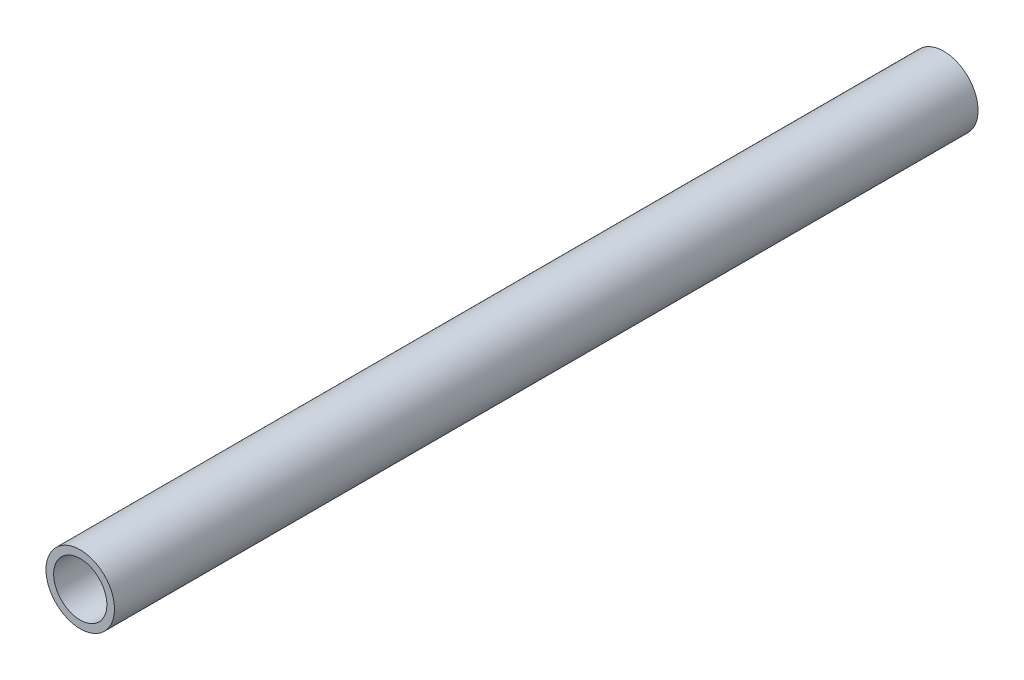
ISO-10303-21;
HEADER;
FILE_DESCRIPTION(('STEP AP214'),'2;1');
FILE_NAME('part.step','',(''),(''),'','','');
FILE_SCHEMA(('AUTOMOTIVE_DESIGN { 1 0 10303 214 1 1 1 1 }'));
ENDSEC;
DATA;
#1=APPLICATION_CONTEXT('core data for automotive mechanical design processes');
#2=APPLICATION_PROTOCOL_DEFINITION('international standard','automotive_design',2000,#1);
#3=PRODUCT_CONTEXT('',#1,'mechanical');
#4=PRODUCT('Part','Part','',(#3));
#5=PRODUCT_RELATED_PRODUCT_CATEGORY('part','',(#4));
#6=PRODUCT_DEFINITION_FORMATION('','',#4);
#7=PRODUCT_DEFINITION_CONTEXT('part definition',#1,'design');
#8=PRODUCT_DEFINITION('design','',#6,#7);
#9=PRODUCT_DEFINITION_SHAPE('','',#8);
#10=(LENGTH_UNIT() NAMED_UNIT(*) SI_UNIT(.MILLI.,.METRE.));
#11=(NAMED_UNIT(*) PLANE_ANGLE_UNIT() SI_UNIT($,.RADIAN.));
#12=(NAMED_UNIT(*) SI_UNIT($,.STERADIAN.) SOLID_ANGLE_UNIT());
#13=UNCERTAINTY_MEASURE_WITH_UNIT(LENGTH_MEASURE(1.E-05),#10,'distance_accuracy_value','');
#14=(GEOMETRIC_REPRESENTATION_CONTEXT(3) GLOBAL_UNCERTAINTY_ASSIGNED_CONTEXT((#13)) GLOBAL_UNIT_ASSIGNED_CONTEXT((#10,
#11,#12)) REPRESENTATION_CONTEXT('',''));
#15=CARTESIAN_POINT('',(0.,0.,0.));
#16=DIRECTION('',(0.,0.,1.));
#17=DIRECTION('',(1.,0.,0.));
#18=AXIS2_PLACEMENT_3D('',#15,#16,#17);
#19=CARTESIAN_POINT('',(0.,0.,227.));
#20=DIRECTION('',(0.,0.,1.));
#21=DIRECTION('',(1.,0.,0.));
#22=AXIS2_PLACEMENT_3D('',#19,#20,#21);
#23=PLANE('',#22);
#24=CARTESIAN_POINT('',(0.,0.,227.));
#25=DIRECTION('',(0.,0.,1.));
#26=DIRECTION('',(1.,0.,0.));
#27=AXIS2_PLACEMENT_3D('',#24,#25,#26);
#28=CIRCLE('',#27,9.);
#29=CARTESIAN_POINT('',(-9.,0.,227.));
#30=VERTEX_POINT('',#29);
#31=EDGE_CURVE('E10',#30,#30,#28,.T.);
#32=ORIENTED_EDGE('',*,*,#31,.T.);
#33=EDGE_LOOP('',(#32));
#34=FACE_BOUND('',#33,.T.);
#35=CARTESIAN_POINT('',(0.,0.,227.));
#36=DIRECTION('',(0.,0.,1.));
#37=DIRECTION('',(1.,0.,0.));
#38=AXIS2_PLACEMENT_3D('',#35,#36,#37);
#39=CIRCLE('',#38,7.);
#40=CARTESIAN_POINT('',(-7.,0.,227.));
#41=VERTEX_POINT('',#40);
#42=EDGE_CURVE('E41',#41,#41,#39,.T.);
#43=ORIENTED_EDGE('',*,*,#42,.F.);
#44=EDGE_LOOP('',(#43));
#45=FACE_BOUND('',#44,.T.);
#46=ADVANCED_FACE('F30',(#34,#45),#23,.T.);
#47=CARTESIAN_POINT('',(0.,0.,0.));
#48=DIRECTION('',(0.,0.,1.));
#49=DIRECTION('',(1.,0.,0.));
#50=AXIS2_PLACEMENT_3D('',#47,#48,#49);
#51=PLANE('',#50);
#52=CARTESIAN_POINT('',(0.,0.,0.));
#53=DIRECTION('',(0.,0.,1.));
#54=DIRECTION('',(1.,0.,0.));
#55=AXIS2_PLACEMENT_3D('',#52,#53,#54);
#56=CIRCLE('',#55,9.);
#57=CARTESIAN_POINT('',(-9.,0.,0.));
#58=VERTEX_POINT('',#57);
#59=EDGE_CURVE('E34',#58,#58,#56,.T.);
#60=ORIENTED_EDGE('',*,*,#59,.F.);
#61=EDGE_LOOP('',(#60));
#62=FACE_BOUND('',#61,.T.);
#63=CARTESIAN_POINT('',(0.,0.,0.));
#64=DIRECTION('',(0.,0.,1.));
#65=DIRECTION('',(1.,0.,0.));
#66=AXIS2_PLACEMENT_3D('',#63,#64,#65);
#67=CIRCLE('',#66,7.);
#68=CARTESIAN_POINT('',(-7.,0.,0.));
#69=VERTEX_POINT('',#68);
#70=EDGE_CURVE('E43',#69,#69,#67,.T.);
#71=ORIENTED_EDGE('',*,*,#70,.T.);
#72=EDGE_LOOP('',(#71));
#73=FACE_BOUND('',#72,.T.);
#74=ADVANCED_FACE('F53',(#62,#73),#51,.F.);
#75=CARTESIAN_POINT('',(0.,0.,227.));
#76=DIRECTION('',(0.,0.,-1.));
#77=DIRECTION('',(-1.,0.,0.));
#78=AXIS2_PLACEMENT_3D('',#75,#76,#77);
#79=CYLINDRICAL_SURFACE('',#78,9.);
#80=CARTESIAN_POINT('',(-9.,0.,227.));
#81=CARTESIAN_POINT('',(-9.,0.,224.635416666667));
#82=CARTESIAN_POINT('',(-9.,0.,222.270833333333));
#83=CARTESIAN_POINT('',(-9.,0.,217.541666666667));
#84=CARTESIAN_POINT('',(-9.,0.,215.177083333333));
#85=CARTESIAN_POINT('',(-9.,0.,210.447916666667));
#86=CARTESIAN_POINT('',(-9.,0.,208.083333333333));
#87=CARTESIAN_POINT('',(-9.,0.,203.354166666667));
#88=CARTESIAN_POINT('',(-9.,0.,200.989583333333));
#89=CARTESIAN_POINT('',(-9.,0.,196.260416666667));
#90=CARTESIAN_POINT('',(-9.,0.,193.895833333333));
#91=CARTESIAN_POINT('',(-9.,0.,189.166666666667));
#92=CARTESIAN_POINT('',(-9.,0.,186.802083333333));
#93=CARTESIAN_POINT('',(-9.,0.,182.072916666667));
#94=CARTESIAN_POINT('',(-9.,0.,179.708333333333));
#95=CARTESIAN_POINT('',(-9.,0.,174.979166666667));
#96=CARTESIAN_POINT('',(-9.,0.,172.614583333333));
#97=CARTESIAN_POINT('',(-9.,0.,167.885416666667));
#98=CARTESIAN_POINT('',(-9.,0.,165.520833333333));
#99=CARTESIAN_POINT('',(-9.,0.,160.791666666667));
#100=CARTESIAN_POINT('',(-9.,0.,158.427083333333));
#101=CARTESIAN_POINT('',(-9.,0.,153.697916666667));
#102=CARTESIAN_POINT('',(-9.,0.,151.333333333333));
#103=CARTESIAN_POINT('',(-9.,0.,146.604166666667));
#104=CARTESIAN_POINT('',(-9.,0.,144.239583333333));
#105=CARTESIAN_POINT('',(-9.,0.,139.510416666667));
#106=CARTESIAN_POINT('',(-9.,0.,137.145833333333));
#107=CARTESIAN_POINT('',(-9.,0.,132.416666666667));
#108=CARTESIAN_POINT('',(-9.,0.,130.052083333333));
#109=CARTESIAN_POINT('',(-9.,0.,125.322916666667));
#110=CARTESIAN_POINT('',(-9.,0.,122.958333333333));
#111=CARTESIAN_POINT('',(-9.,0.,118.229166666667));
#112=CARTESIAN_POINT('',(-9.,0.,115.864583333333));
#113=CARTESIAN_POINT('',(-9.,0.,111.135416666667));
#114=CARTESIAN_POINT('',(-9.,0.,108.770833333333));
#115=CARTESIAN_POINT('',(-9.,0.,104.041666666667));
#116=CARTESIAN_POINT('',(-9.,0.,101.677083333333));
#117=CARTESIAN_POINT('',(-9.,0.,96.9479166666667));
#118=CARTESIAN_POINT('',(-9.,0.,94.5833333333333));
#119=CARTESIAN_POINT('',(-9.,0.,89.8541666666667));
#120=CARTESIAN_POINT('',(-9.,0.,87.4895833333333));
#121=CARTESIAN_POINT('',(-9.,0.,82.7604166666667));
#122=CARTESIAN_POINT('',(-9.,0.,80.3958333333333));
#123=CARTESIAN_POINT('',(-9.,0.,75.6666666666667));
#124=CARTESIAN_POINT('',(-9.,0.,73.3020833333333));
#125=CARTESIAN_POINT('',(-9.,0.,68.5729166666667));
#126=CARTESIAN_POINT('',(-9.,0.,66.2083333333333));
#127=CARTESIAN_POINT('',(-9.,0.,61.4791666666667));
#128=CARTESIAN_POINT('',(-9.,0.,59.1145833333333));
#129=CARTESIAN_POINT('',(-9.,0.,54.3854166666667));
#130=CARTESIAN_POINT('',(-9.,0.,52.0208333333333));
#131=CARTESIAN_POINT('',(-9.,0.,47.2916666666667));
#132=CARTESIAN_POINT('',(-9.,0.,44.9270833333333));
#133=CARTESIAN_POINT('',(-9.,0.,40.1979166666667));
#134=CARTESIAN_POINT('',(-9.,0.,37.8333333333333));
#135=CARTESIAN_POINT('',(-9.,0.,33.1041666666667));
#136=CARTESIAN_POINT('',(-9.,0.,30.7395833333333));
#137=CARTESIAN_POINT('',(-9.,0.,26.0104166666667));
#138=CARTESIAN_POINT('',(-9.,0.,23.6458333333333));
#139=CARTESIAN_POINT('',(-9.,0.,18.9166666666667));
#140=CARTESIAN_POINT('',(-9.,0.,16.5520833333333));
#141=CARTESIAN_POINT('',(-9.,0.,11.8229166666667));
#142=CARTESIAN_POINT('',(-9.,0.,9.45833333333334));
#143=CARTESIAN_POINT('',(-9.,0.,4.72916666666667));
#144=CARTESIAN_POINT('',(-9.,0.,2.36458333333333));
#145=CARTESIAN_POINT('',(-9.,0.,0.));
#146=B_SPLINE_CURVE_WITH_KNOTS('',3,(#80,#81,#82,#83,#84,#85,#86,#87,#88,#89,#90,#91,#92,#93,
#94,#95,#96,#97,#98,#99,#100,#101,#102,#103,#104,#105,#106,#107,#108,#109,#110,#111,#112,#113,
#114,#115,#116,#117,#118,#119,#120,#121,#122,#123,#124,#125,#126,#127,#128,#129,#130,#131,#132,
#133,#134,#135,#136,#137,#138,#139,#140,#141,#142,#143,#144,#145),.UNSPECIFIED.,.F.,.F.,(4,2,2,
2,2,2,2,2,2,2,2,2,2,2,2,2,2,2,2,2,2,2,2,2,2,2,2,2,2,2,2,2,4),(0.,7.09374999999998,14.1875,
21.28125,28.375,35.46875,42.5625,49.65625,56.75,63.84375,70.9375,78.03125,85.125,92.21875,
99.3125,106.40625,113.5,120.59375,127.6875,134.78125,141.875,148.96875,156.0625,163.15625,
170.25,177.34375,184.4375,191.53125,198.625,205.71875,212.8125,219.90625,227.),.UNSPECIFIED.);
#147=EDGE_CURVE('BSEAM32',#30,#58,#146,.T.);
#148=ORIENTED_EDGE('',*,*,#31,.F.);
#149=ORIENTED_EDGE('',*,*,#59,.T.);
#150=ORIENTED_EDGE('',*,*,#147,.T.);
#151=ORIENTED_EDGE('',*,*,#147,.F.);
#152=EDGE_LOOP('',(#148,#150,#149,#151));
#153=FACE_BOUND('',#152,.T.);
#154=ADVANCED_FACE('F32',(#153),#79,.T.);
#155=CARTESIAN_POINT('',(0.,0.,227.));
#156=DIRECTION('',(0.,0.,-1.));
#157=DIRECTION('',(-1.,0.,0.));
#158=AXIS2_PLACEMENT_3D('',#155,#156,#157);
#159=CYLINDRICAL_SURFACE('',#158,7.);
#160=CARTESIAN_POINT('',(-7.,0.,227.));
#161=CARTESIAN_POINT('',(-7.,0.,224.635416666667));
#162=CARTESIAN_POINT('',(-7.,0.,222.270833333333));
#163=CARTESIAN_POINT('',(-7.,0.,217.541666666667));
#164=CARTESIAN_POINT('',(-7.,0.,215.177083333333));
#165=CARTESIAN_POINT('',(-7.,0.,210.447916666667));
#166=CARTESIAN_POINT('',(-7.,0.,208.083333333333));
#167=CARTESIAN_POINT('',(-7.,0.,203.354166666667));
#168=CARTESIAN_POINT('',(-7.,0.,200.989583333333));
#169=CARTESIAN_POINT('',(-7.,0.,196.260416666667));
#170=CARTESIAN_POINT('',(-7.,0.,193.895833333333));
#171=CARTESIAN_POINT('',(-7.,0.,189.166666666667));
#172=CARTESIAN_POINT('',(-7.,0.,186.802083333333));
#173=CARTESIAN_POINT('',(-7.,0.,182.072916666667));
#174=CARTESIAN_POINT('',(-7.,0.,179.708333333333));
#175=CARTESIAN_POINT('',(-7.,0.,174.979166666667));
#176=CARTESIAN_POINT('',(-7.,0.,172.614583333333));
#177=CARTESIAN_POINT('',(-7.,0.,167.885416666667));
#178=CARTESIAN_POINT('',(-7.,0.,165.520833333333));
#179=CARTESIAN_POINT('',(-7.,0.,160.791666666667));
#180=CARTESIAN_POINT('',(-7.,0.,158.427083333333));
#181=CARTESIAN_POINT('',(-7.,0.,153.697916666667));
#182=CARTESIAN_POINT('',(-7.,0.,151.333333333333));
#183=CARTESIAN_POINT('',(-7.,0.,146.604166666667));
#184=CARTESIAN_POINT('',(-7.,0.,144.239583333333));
#185=CARTESIAN_POINT('',(-7.,0.,139.510416666667));
#186=CARTESIAN_POINT('',(-7.,0.,137.145833333333));
#187=CARTESIAN_POINT('',(-7.,0.,132.416666666667));
#188=CARTESIAN_POINT('',(-7.,0.,130.052083333333));
#189=CARTESIAN_POINT('',(-7.,0.,125.322916666667));
#190=CARTESIAN_POINT('',(-7.,0.,122.958333333333));
#191=CARTESIAN_POINT('',(-7.,0.,118.229166666667));
#192=CARTESIAN_POINT('',(-7.,0.,115.864583333333));
#193=CARTESIAN_POINT('',(-7.,0.,111.135416666667));
#194=CARTESIAN_POINT('',(-7.,0.,108.770833333333));
#195=CARTESIAN_POINT('',(-7.,0.,104.041666666667));
#196=CARTESIAN_POINT('',(-7.,0.,101.677083333333));
#197=CARTESIAN_POINT('',(-7.,0.,96.9479166666667));
#198=CARTESIAN_POINT('',(-7.,0.,94.5833333333334));
#199=CARTESIAN_POINT('',(-7.,0.,89.8541666666667));
#200=CARTESIAN_POINT('',(-7.,0.,87.4895833333333));
#201=CARTESIAN_POINT('',(-7.,0.,82.7604166666667));
#202=CARTESIAN_POINT('',(-7.,0.,80.3958333333333));
#203=CARTESIAN_POINT('',(-7.,0.,75.6666666666667));
#204=CARTESIAN_POINT('',(-7.,0.,73.3020833333334));
#205=CARTESIAN_POINT('',(-7.,0.,68.5729166666667));
#206=CARTESIAN_POINT('',(-7.,0.,66.2083333333333));
#207=CARTESIAN_POINT('',(-7.,0.,61.4791666666667));
#208=CARTESIAN_POINT('',(-7.,0.,59.1145833333333));
#209=CARTESIAN_POINT('',(-7.,0.,54.3854166666667));
#210=CARTESIAN_POINT('',(-7.,0.,52.0208333333333));
#211=CARTESIAN_POINT('',(-7.,0.,47.2916666666667));
#212=CARTESIAN_POINT('',(-7.,0.,44.9270833333333));
#213=CARTESIAN_POINT('',(-7.,0.,40.1979166666667));
#214=CARTESIAN_POINT('',(-7.,0.,37.8333333333333));
#215=CARTESIAN_POINT('',(-7.,0.,33.1041666666667));
#216=CARTESIAN_POINT('',(-7.,0.,30.7395833333333));
#217=CARTESIAN_POINT('',(-7.,0.,26.0104166666667));
#218=CARTESIAN_POINT('',(-7.,0.,23.6458333333333));
#219=CARTESIAN_POINT('',(-7.,0.,18.9166666666667));
#220=CARTESIAN_POINT('',(-7.,0.,16.5520833333333));
#221=CARTESIAN_POINT('',(-7.,0.,11.8229166666667));
#222=CARTESIAN_POINT('',(-7.,0.,9.45833333333334));
#223=CARTESIAN_POINT('',(-7.,0.,4.72916666666667));
#224=CARTESIAN_POINT('',(-7.,0.,2.36458333333333));
#225=CARTESIAN_POINT('',(-7.,0.,0.));
#226=B_SPLINE_CURVE_WITH_KNOTS('',3,(#160,#161,#162,#163,#164,#165,#166,#167,#168,#169,#170,
#171,#172,#173,#174,#175,#176,#177,#178,#179,#180,#181,#182,#183,#184,#185,#186,#187,#188,#189,
#190,#191,#192,#193,#194,#195,#196,#197,#198,#199,#200,#201,#202,#203,#204,#205,#206,#207,#208,
#209,#210,#211,#212,#213,#214,#215,#216,#217,#218,#219,#220,#221,#222,#223,#224,#225),
.UNSPECIFIED.,.F.,.F.,(4,2,2,2,2,2,2,2,2,2,2,2,2,2,2,2,2,2,2,2,2,2,2,2,2,2,2,2,2,2,2,2,4),(0.,
7.09375000000001,14.1875,21.28125,28.375,35.46875,42.5625,49.65625,56.75,63.84375,70.9375,
78.03125,85.125,92.21875,99.3125,106.40625,113.5,120.59375,127.6875,134.78125,141.875,148.96875,
156.0625,163.15625,170.25,177.34375,184.4375,191.53125,198.625,205.71875,212.8125,219.90625,
227.),.UNSPECIFIED.);
#227=EDGE_CURVE('BSEAM49',#41,#69,#226,.T.);
#228=ORIENTED_EDGE('',*,*,#42,.T.);
#229=ORIENTED_EDGE('',*,*,#70,.F.);
#230=ORIENTED_EDGE('',*,*,#227,.T.);
#231=ORIENTED_EDGE('',*,*,#227,.F.);
#232=EDGE_LOOP('',(#228,#230,#229,#231));
#233=FACE_BOUND('',#232,.T.);
#234=ADVANCED_FACE('F49',(#233),#159,.F.);
#235=CLOSED_SHELL('',(#46,#74,#154,#234));
#236=MANIFOLD_SOLID_BREP('B2',#235);
#237=ADVANCED_BREP_SHAPE_REPRESENTATION('',(#18,#236),#14);
#238=SHAPE_DEFINITION_REPRESENTATION(#9,#237);
ENDSEC;
END-ISO-10303-21;
